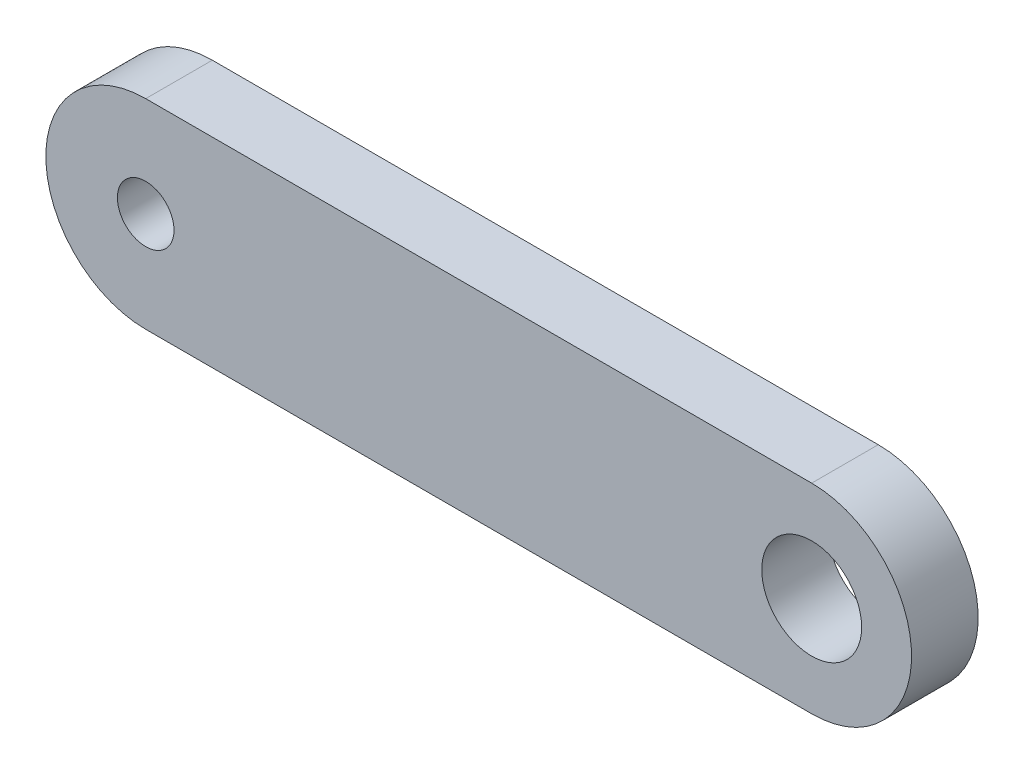
ISO-10303-21;
HEADER;
FILE_DESCRIPTION(('STEP AP214'),'2;1');
FILE_NAME('part.step','',(''),(''),'','','');
FILE_SCHEMA(('AUTOMOTIVE_DESIGN { 1 0 10303 214 1 1 1 1 }'));
ENDSEC;
DATA;
#1=APPLICATION_CONTEXT('core data for automotive mechanical design processes');
#2=APPLICATION_PROTOCOL_DEFINITION('international standard','automotive_design',2000,#1);
#3=PRODUCT_CONTEXT('',#1,'mechanical');
#4=PRODUCT('Part','Part','',(#3));
#5=PRODUCT_RELATED_PRODUCT_CATEGORY('part','',(#4));
#6=PRODUCT_DEFINITION_FORMATION('','',#4);
#7=PRODUCT_DEFINITION_CONTEXT('part definition',#1,'design');
#8=PRODUCT_DEFINITION('design','',#6,#7);
#9=PRODUCT_DEFINITION_SHAPE('','',#8);
#10=(LENGTH_UNIT() NAMED_UNIT(*) SI_UNIT(.MILLI.,.METRE.));
#11=(NAMED_UNIT(*) PLANE_ANGLE_UNIT() SI_UNIT($,.RADIAN.));
#12=(NAMED_UNIT(*) SI_UNIT($,.STERADIAN.) SOLID_ANGLE_UNIT());
#13=UNCERTAINTY_MEASURE_WITH_UNIT(LENGTH_MEASURE(1.E-05),#10,'distance_accuracy_value','');
#14=(GEOMETRIC_REPRESENTATION_CONTEXT(3) GLOBAL_UNCERTAINTY_ASSIGNED_CONTEXT((#13)) GLOBAL_UNIT_ASSIGNED_CONTEXT((#10,
#11,#12)) REPRESENTATION_CONTEXT('',''));
#15=CARTESIAN_POINT('',(0.,0.,0.));
#16=DIRECTION('',(0.,0.,1.));
#17=DIRECTION('',(1.,0.,0.));
#18=AXIS2_PLACEMENT_3D('',#15,#16,#17);
#19=CARTESIAN_POINT('',(0.,0.,2.));
#20=DIRECTION('',(0.,0.,1.));
#21=DIRECTION('',(1.,0.,0.));
#22=AXIS2_PLACEMENT_3D('',#19,#20,#21);
#23=PLANE('',#22);
#24=CARTESIAN_POINT('',(0.,0.,2.));
#25=DIRECTION('',(0.,0.,1.));
#26=DIRECTION('',(1.,0.,0.));
#27=AXIS2_PLACEMENT_3D('',#24,#25,#26);
#28=CIRCLE('',#27,3.);
#29=CARTESIAN_POINT('',(0.,3.,2.));
#30=VERTEX_POINT('',#29);
#31=CARTESIAN_POINT('',(0.,-3.,2.));
#32=VERTEX_POINT('',#31);
#33=EDGE_CURVE('E88',#30,#32,#28,.T.);
#34=ORIENTED_EDGE('',*,*,#33,.T.);
#35=DIRECTION('',(1.,0.,0.));
#36=VECTOR('',#35,1.);
#37=CARTESIAN_POINT('',(0.,-3.,2.));
#38=LINE('',#37,#36);
#39=CARTESIAN_POINT('',(20.,-3.,2.));
#40=VERTEX_POINT('',#39);
#41=EDGE_CURVE('E83',#32,#40,#38,.T.);
#42=ORIENTED_EDGE('',*,*,#41,.T.);
#43=CARTESIAN_POINT('',(20.,0.,2.));
#44=DIRECTION('',(0.,0.,1.));
#45=DIRECTION('',(1.,0.,0.));
#46=AXIS2_PLACEMENT_3D('',#43,#44,#45);
#47=CIRCLE('',#46,3.);
#48=CARTESIAN_POINT('',(20.,3.,2.));
#49=VERTEX_POINT('',#48);
#50=EDGE_CURVE('E86',#40,#49,#47,.T.);
#51=ORIENTED_EDGE('',*,*,#50,.T.);
#52=DIRECTION('',(-1.,0.,0.));
#53=VECTOR('',#52,1.);
#54=CARTESIAN_POINT('',(0.,3.,2.));
#55=LINE('',#54,#53);
#56=EDGE_CURVE('E53',#49,#30,#55,.T.);
#57=ORIENTED_EDGE('',*,*,#56,.T.);
#58=EDGE_LOOP('',(#34,#42,#51,#57));
#59=FACE_BOUND('',#58,.T.);
#60=CARTESIAN_POINT('',(20.,0.,2.));
#61=DIRECTION('',(0.,0.,1.));
#62=DIRECTION('',(1.,0.,0.));
#63=AXIS2_PLACEMENT_3D('',#60,#61,#62);
#64=CIRCLE('',#63,1.5);
#65=CARTESIAN_POINT('',(21.5,0.,2.));
#66=VERTEX_POINT('',#65);
#67=EDGE_CURVE('E103',#66,#66,#64,.T.);
#68=ORIENTED_EDGE('',*,*,#67,.F.);
#69=EDGE_LOOP('',(#68));
#70=FACE_BOUND('',#69,.T.);
#71=CARTESIAN_POINT('',(0.,0.,2.));
#72=DIRECTION('',(0.,0.,-1.));
#73=DIRECTION('',(-1.,0.,0.));
#74=AXIS2_PLACEMENT_3D('',#71,#72,#73);
#75=CIRCLE('',#74,0.85);
#76=CARTESIAN_POINT('',(-0.85,0.,2.));
#77=VERTEX_POINT('',#76);
#78=EDGE_CURVE('E118',#77,#77,#75,.T.);
#79=ORIENTED_EDGE('',*,*,#78,.T.);
#80=EDGE_LOOP('',(#79));
#81=FACE_BOUND('',#80,.T.);
#82=ADVANCED_FACE('F36',(#59,#70,#81),#23,.T.);
#83=CARTESIAN_POINT('',(0.,0.,0.));
#84=DIRECTION('',(0.,0.,1.));
#85=DIRECTION('',(1.,0.,0.));
#86=AXIS2_PLACEMENT_3D('',#83,#84,#85);
#87=PLANE('',#86);
#88=CARTESIAN_POINT('',(0.,0.,0.));
#89=DIRECTION('',(0.,0.,1.));
#90=DIRECTION('',(1.,0.,0.));
#91=AXIS2_PLACEMENT_3D('',#88,#89,#90);
#92=CIRCLE('',#91,3.);
#93=CARTESIAN_POINT('',(0.,3.,0.));
#94=VERTEX_POINT('',#93);
#95=CARTESIAN_POINT('',(0.,-3.,0.));
#96=VERTEX_POINT('',#95);
#97=EDGE_CURVE('E100',#94,#96,#92,.T.);
#98=ORIENTED_EDGE('',*,*,#97,.F.);
#99=DIRECTION('',(-1.,0.,0.));
#100=VECTOR('',#99,1.);
#101=CARTESIAN_POINT('',(0.,3.,0.));
#102=LINE('',#101,#100);
#103=CARTESIAN_POINT('',(20.,3.,0.));
#104=VERTEX_POINT('',#103);
#105=EDGE_CURVE('E76',#104,#94,#102,.T.);
#106=ORIENTED_EDGE('',*,*,#105,.F.);
#107=CARTESIAN_POINT('',(20.,0.,0.));
#108=DIRECTION('',(0.,0.,1.));
#109=DIRECTION('',(1.,0.,0.));
#110=AXIS2_PLACEMENT_3D('',#107,#108,#109);
#111=CIRCLE('',#110,3.);
#112=CARTESIAN_POINT('',(20.,-3.,0.));
#113=VERTEX_POINT('',#112);
#114=EDGE_CURVE('E70',#113,#104,#111,.T.);
#115=ORIENTED_EDGE('',*,*,#114,.F.);
#116=DIRECTION('',(1.,0.,0.));
#117=VECTOR('',#116,1.);
#118=CARTESIAN_POINT('',(0.,-3.,0.));
#119=LINE('',#118,#117);
#120=EDGE_CURVE('E92',#96,#113,#119,.T.);
#121=ORIENTED_EDGE('',*,*,#120,.F.);
#122=EDGE_LOOP('',(#98,#106,#115,#121));
#123=FACE_BOUND('',#122,.T.);
#124=CARTESIAN_POINT('',(20.,0.,0.));
#125=DIRECTION('',(0.,0.,1.));
#126=DIRECTION('',(1.,0.,0.));
#127=AXIS2_PLACEMENT_3D('',#124,#125,#126);
#128=CIRCLE('',#127,1.5);
#129=CARTESIAN_POINT('',(21.5,0.,0.));
#130=VERTEX_POINT('',#129);
#131=EDGE_CURVE('E115',#130,#130,#128,.T.);
#132=ORIENTED_EDGE('',*,*,#131,.T.);
#133=EDGE_LOOP('',(#132));
#134=FACE_BOUND('',#133,.T.);
#135=CARTESIAN_POINT('',(0.,0.,0.));
#136=DIRECTION('',(0.,0.,-1.));
#137=DIRECTION('',(-1.,0.,0.));
#138=AXIS2_PLACEMENT_3D('',#135,#136,#137);
#139=CIRCLE('',#138,0.85);
#140=CARTESIAN_POINT('',(-0.85,0.,0.));
#141=VERTEX_POINT('',#140);
#142=EDGE_CURVE('E121',#141,#141,#139,.T.);
#143=ORIENTED_EDGE('',*,*,#142,.F.);
#144=EDGE_LOOP('',(#143));
#145=FACE_BOUND('',#144,.T.);
#146=ADVANCED_FACE('F111',(#123,#134,#145),#87,.F.);
#147=CARTESIAN_POINT('',(0.,0.,2.));
#148=DIRECTION('',(0.,0.,-1.));
#149=DIRECTION('',(-1.,0.,0.));
#150=AXIS2_PLACEMENT_3D('',#147,#148,#149);
#151=CYLINDRICAL_SURFACE('',#150,3.);
#152=ORIENTED_EDGE('',*,*,#97,.T.);
#153=DIRECTION('',(0.,0.,-1.));
#154=VECTOR('',#153,1.);
#155=CARTESIAN_POINT('',(0.,-3.,2.));
#156=LINE('',#155,#154);
#157=EDGE_CURVE('E11',#32,#96,#156,.T.);
#158=ORIENTED_EDGE('',*,*,#157,.F.);
#159=ORIENTED_EDGE('',*,*,#33,.F.);
#160=DIRECTION('',(0.,0.,-1.));
#161=VECTOR('',#160,1.);
#162=CARTESIAN_POINT('',(0.,3.,2.));
#163=LINE('',#162,#161);
#164=EDGE_CURVE('E96',#30,#94,#163,.T.);
#165=ORIENTED_EDGE('',*,*,#164,.T.);
#166=EDGE_LOOP('',(#152,#158,#159,#165));
#167=FACE_BOUND('',#166,.T.);
#168=ADVANCED_FACE('F38',(#167),#151,.T.);
#169=CARTESIAN_POINT('',(0.,-3.,2.));
#170=DIRECTION('',(0.,1.,0.));
#171=DIRECTION('',(0.,0.,1.));
#172=AXIS2_PLACEMENT_3D('',#169,#170,#171);
#173=PLANE('',#172);
#174=ORIENTED_EDGE('',*,*,#120,.T.);
#175=DIRECTION('',(0.,0.,-1.));
#176=VECTOR('',#175,1.);
#177=CARTESIAN_POINT('',(20.,-3.,2.));
#178=LINE('',#177,#176);
#179=EDGE_CURVE('E45',#40,#113,#178,.T.);
#180=ORIENTED_EDGE('',*,*,#179,.F.);
#181=ORIENTED_EDGE('',*,*,#41,.F.);
#182=ORIENTED_EDGE('',*,*,#157,.T.);
#183=EDGE_LOOP('',(#174,#180,#181,#182));
#184=FACE_BOUND('',#183,.T.);
#185=ADVANCED_FACE('F91',(#184),#173,.F.);
#186=CARTESIAN_POINT('',(20.,0.,2.));
#187=DIRECTION('',(0.,0.,-1.));
#188=DIRECTION('',(-1.,0.,0.));
#189=AXIS2_PLACEMENT_3D('',#186,#187,#188);
#190=CYLINDRICAL_SURFACE('',#189,3.);
#191=ORIENTED_EDGE('',*,*,#114,.T.);
#192=DIRECTION('',(0.,0.,-1.));
#193=VECTOR('',#192,1.);
#194=CARTESIAN_POINT('',(20.,3.,2.));
#195=LINE('',#194,#193);
#196=EDGE_CURVE('E93',#49,#104,#195,.T.);
#197=ORIENTED_EDGE('',*,*,#196,.F.);
#198=ORIENTED_EDGE('',*,*,#50,.F.);
#199=ORIENTED_EDGE('',*,*,#179,.T.);
#200=EDGE_LOOP('',(#191,#197,#198,#199));
#201=FACE_BOUND('',#200,.T.);
#202=ADVANCED_FACE('F94',(#201),#190,.T.);
#203=CARTESIAN_POINT('',(0.,3.,2.));
#204=DIRECTION('',(0.,-1.,0.));
#205=DIRECTION('',(0.,0.,-1.));
#206=AXIS2_PLACEMENT_3D('',#203,#204,#205);
#207=PLANE('',#206);
#208=ORIENTED_EDGE('',*,*,#105,.T.);
#209=ORIENTED_EDGE('',*,*,#164,.F.);
#210=ORIENTED_EDGE('',*,*,#56,.F.);
#211=ORIENTED_EDGE('',*,*,#196,.T.);
#212=EDGE_LOOP('',(#208,#209,#210,#211));
#213=FACE_BOUND('',#212,.T.);
#214=ADVANCED_FACE('F108',(#213),#207,.F.);
#215=CARTESIAN_POINT('',(20.,0.,2.));
#216=DIRECTION('',(0.,0.,-1.));
#217=DIRECTION('',(-1.,0.,0.));
#218=AXIS2_PLACEMENT_3D('',#215,#216,#217);
#219=CYLINDRICAL_SURFACE('',#218,1.5);
#220=ORIENTED_EDGE('',*,*,#67,.T.);
#221=EDGE_LOOP('',(#220));
#222=FACE_BOUND('',#221,.T.);
#223=ORIENTED_EDGE('',*,*,#131,.F.);
#224=EDGE_LOOP('',(#223));
#225=FACE_BOUND('',#224,.T.);
#226=ADVANCED_FACE('F131',(#222,#225),#219,.F.);
#227=CARTESIAN_POINT('',(0.,0.,2.));
#228=DIRECTION('',(0.,0.,-1.));
#229=DIRECTION('',(-1.,0.,0.));
#230=AXIS2_PLACEMENT_3D('',#227,#228,#229);
#231=CYLINDRICAL_SURFACE('',#230,0.85);
#232=ORIENTED_EDGE('',*,*,#78,.F.);
#233=EDGE_LOOP('',(#232));
#234=FACE_BOUND('',#233,.T.);
#235=ORIENTED_EDGE('',*,*,#142,.T.);
#236=EDGE_LOOP('',(#235));
#237=FACE_BOUND('',#236,.T.);
#238=ADVANCED_FACE('F128',(#234,#237),#231,.F.);
#239=CLOSED_SHELL('',(#82,#146,#168,#185,#202,#214,#226,#238));
#240=MANIFOLD_SOLID_BREP('B2',#239);
#241=ADVANCED_BREP_SHAPE_REPRESENTATION('',(#18,#240),#14);
#242=SHAPE_DEFINITION_REPRESENTATION(#9,#241);
ENDSEC;
END-ISO-10303-21;
